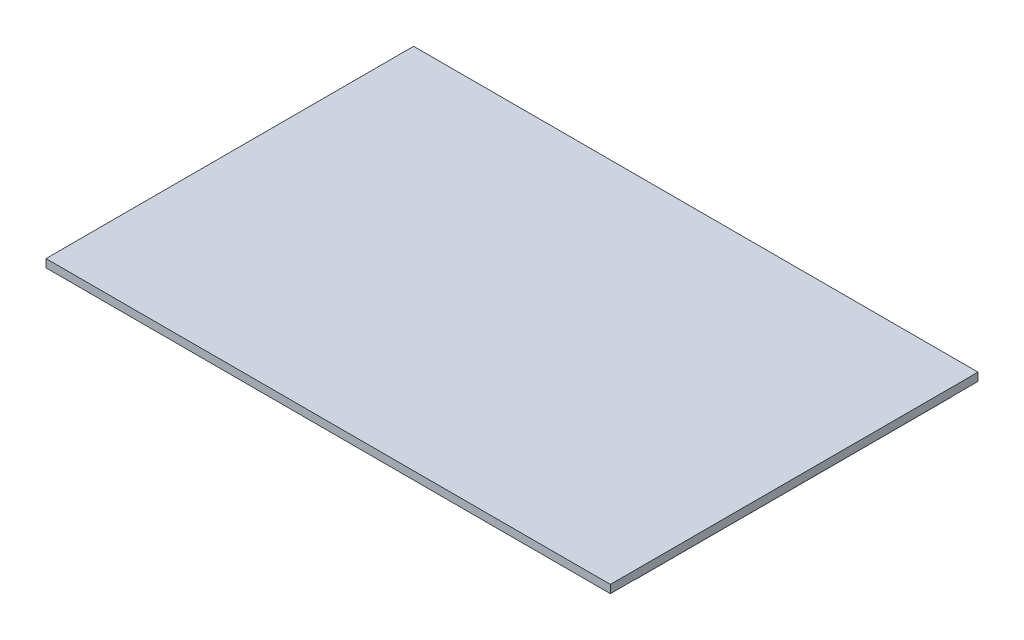
ISO-10303-21;
HEADER;
FILE_DESCRIPTION(('STEP AP214'),'2;1');
FILE_NAME('part.step','',(''),(''),'','','');
FILE_SCHEMA(('AUTOMOTIVE_DESIGN { 1 0 10303 214 1 1 1 1 }'));
ENDSEC;
DATA;
#1=APPLICATION_CONTEXT('core data for automotive mechanical design processes');
#2=APPLICATION_PROTOCOL_DEFINITION('international standard','automotive_design',2000,#1);
#3=PRODUCT_CONTEXT('',#1,'mechanical');
#4=PRODUCT('Part','Part','',(#3));
#5=PRODUCT_RELATED_PRODUCT_CATEGORY('part','',(#4));
#6=PRODUCT_DEFINITION_FORMATION('','',#4);
#7=PRODUCT_DEFINITION_CONTEXT('part definition',#1,'design');
#8=PRODUCT_DEFINITION('design','',#6,#7);
#9=PRODUCT_DEFINITION_SHAPE('','',#8);
#10=(LENGTH_UNIT() NAMED_UNIT(*) SI_UNIT(.MILLI.,.METRE.));
#11=(NAMED_UNIT(*) PLANE_ANGLE_UNIT() SI_UNIT($,.RADIAN.));
#12=(NAMED_UNIT(*) SI_UNIT($,.STERADIAN.) SOLID_ANGLE_UNIT());
#13=UNCERTAINTY_MEASURE_WITH_UNIT(LENGTH_MEASURE(1.E-05),#10,'distance_accuracy_value','');
#14=(GEOMETRIC_REPRESENTATION_CONTEXT(3) GLOBAL_UNCERTAINTY_ASSIGNED_CONTEXT((#13)) GLOBAL_UNIT_ASSIGNED_CONTEXT((#10,
#11,#12)) REPRESENTATION_CONTEXT('',''));
#15=CARTESIAN_POINT('',(0.,0.,0.));
#16=DIRECTION('',(0.,0.,1.));
#17=DIRECTION('',(1.,0.,0.));
#18=AXIS2_PLACEMENT_3D('',#15,#16,#17);
#19=CARTESIAN_POINT('',(0.,-0.0508,-5.08));
#20=DIRECTION('',(1.,0.,0.));
#21=DIRECTION('',(0.,0.,-1.));
#22=AXIS2_PLACEMENT_3D('',#19,#20,#21);
#23=PLANE('',#22);
#24=DIRECTION('',(0.,0.,-1.));
#25=VECTOR('',#24,1.);
#26=CARTESIAN_POINT('',(0.,0.,-5.08));
#27=LINE('',#26,#25);
#28=CARTESIAN_POINT('',(0.,0.,-5.08));
#29=VERTEX_POINT('',#28);
#30=CARTESIAN_POINT('',(0.,0.,-67.31));
#31=VERTEX_POINT('',#30);
#32=EDGE_CURVE('E106',#29,#31,#27,.T.);
#33=ORIENTED_EDGE('',*,*,#32,.T.);
#34=DIRECTION('',(0.,1.,0.));
#35=VECTOR('',#34,1.);
#36=CARTESIAN_POINT('',(0.,-0.0508,-67.31));
#37=LINE('',#36,#35);
#38=CARTESIAN_POINT('',(0.,-0.0508,-67.31));
#39=VERTEX_POINT('',#38);
#40=EDGE_CURVE('E12',#39,#31,#37,.T.);
#41=ORIENTED_EDGE('',*,*,#40,.F.);
#42=DIRECTION('',(0.,0.,-1.));
#43=VECTOR('',#42,1.);
#44=CARTESIAN_POINT('',(0.,-0.0508,-5.08));
#45=LINE('',#44,#43);
#46=CARTESIAN_POINT('',(0.,-0.0508,-5.08));
#47=VERTEX_POINT('',#46);
#48=EDGE_CURVE('E94',#47,#39,#45,.T.);
#49=ORIENTED_EDGE('',*,*,#48,.F.);
#50=DIRECTION('',(0.,1.,0.));
#51=VECTOR('',#50,1.);
#52=CARTESIAN_POINT('',(0.,-0.0508,-5.08));
#53=LINE('',#52,#51);
#54=EDGE_CURVE('E102',#47,#29,#53,.T.);
#55=ORIENTED_EDGE('',*,*,#54,.T.);
#56=EDGE_LOOP('',(#33,#41,#49,#55));
#57=FACE_BOUND('',#56,.T.);
#58=ADVANCED_FACE('F43',(#57),#23,.F.);
#59=CARTESIAN_POINT('',(0.,-0.0508,-67.31));
#60=DIRECTION('',(0.,0.,1.));
#61=DIRECTION('',(1.,0.,0.));
#62=AXIS2_PLACEMENT_3D('',#59,#60,#61);
#63=PLANE('',#62);
#64=DIRECTION('',(1.,0.,0.));
#65=VECTOR('',#64,1.);
#66=CARTESIAN_POINT('',(0.,0.,-67.31));
#67=LINE('',#66,#65);
#68=CARTESIAN_POINT('',(111.125,0.,-67.31));
#69=VERTEX_POINT('',#68);
#70=EDGE_CURVE('E98',#31,#69,#67,.T.);
#71=ORIENTED_EDGE('',*,*,#70,.T.);
#72=DIRECTION('',(0.,1.,0.));
#73=VECTOR('',#72,1.);
#74=CARTESIAN_POINT('',(111.125,-0.0508,-67.31));
#75=LINE('',#74,#73);
#76=CARTESIAN_POINT('',(111.125,-0.0508,-67.31));
#77=VERTEX_POINT('',#76);
#78=EDGE_CURVE('E51',#77,#69,#75,.T.);
#79=ORIENTED_EDGE('',*,*,#78,.F.);
#80=DIRECTION('',(1.,0.,0.));
#81=VECTOR('',#80,1.);
#82=CARTESIAN_POINT('',(0.,-0.0508,-67.31));
#83=LINE('',#82,#81);
#84=EDGE_CURVE('E89',#39,#77,#83,.T.);
#85=ORIENTED_EDGE('',*,*,#84,.F.);
#86=ORIENTED_EDGE('',*,*,#40,.T.);
#87=EDGE_LOOP('',(#71,#79,#85,#86));
#88=FACE_BOUND('',#87,.T.);
#89=ADVANCED_FACE('F97',(#88),#63,.F.);
#90=CARTESIAN_POINT('',(111.125,-0.0508,-5.08));
#91=DIRECTION('',(-1.,0.,0.));
#92=DIRECTION('',(0.,0.,1.));
#93=AXIS2_PLACEMENT_3D('',#90,#91,#92);
#94=PLANE('',#93);
#95=DIRECTION('',(0.,0.,1.));
#96=VECTOR('',#95,1.);
#97=CARTESIAN_POINT('',(111.125,0.,-5.08));
#98=LINE('',#97,#96);
#99=CARTESIAN_POINT('',(111.125,0.,-5.08));
#100=VERTEX_POINT('',#99);
#101=EDGE_CURVE('E76',#69,#100,#98,.T.);
#102=ORIENTED_EDGE('',*,*,#101,.T.);
#103=DIRECTION('',(0.,1.,0.));
#104=VECTOR('',#103,1.);
#105=CARTESIAN_POINT('',(111.125,-0.0508,-5.08));
#106=LINE('',#105,#104);
#107=CARTESIAN_POINT('',(111.125,-0.0508,-5.08));
#108=VERTEX_POINT('',#107);
#109=EDGE_CURVE('E99',#108,#100,#106,.T.);
#110=ORIENTED_EDGE('',*,*,#109,.F.);
#111=DIRECTION('',(0.,0.,1.));
#112=VECTOR('',#111,1.);
#113=CARTESIAN_POINT('',(111.125,-0.0508,-5.08));
#114=LINE('',#113,#112);
#115=EDGE_CURVE('E92',#77,#108,#114,.T.);
#116=ORIENTED_EDGE('',*,*,#115,.F.);
#117=ORIENTED_EDGE('',*,*,#78,.T.);
#118=EDGE_LOOP('',(#102,#110,#116,#117));
#119=FACE_BOUND('',#118,.T.);
#120=ADVANCED_FACE('F100',(#119),#94,.F.);
#121=CARTESIAN_POINT('',(0.,-0.0508,-5.08));
#122=DIRECTION('',(0.,0.,-1.));
#123=DIRECTION('',(-1.,0.,0.));
#124=AXIS2_PLACEMENT_3D('',#121,#122,#123);
#125=PLANE('',#124);
#126=DIRECTION('',(-1.,0.,0.));
#127=VECTOR('',#126,1.);
#128=CARTESIAN_POINT('',(0.,0.,-5.08));
#129=LINE('',#128,#127);
#130=EDGE_CURVE('E82',#100,#29,#129,.T.);
#131=ORIENTED_EDGE('',*,*,#130,.T.);
#132=ORIENTED_EDGE('',*,*,#54,.F.);
#133=DIRECTION('',(-1.,0.,0.));
#134=VECTOR('',#133,1.);
#135=CARTESIAN_POINT('',(0.,-0.0508,-5.08));
#136=LINE('',#135,#134);
#137=EDGE_CURVE('E59',#108,#47,#136,.T.);
#138=ORIENTED_EDGE('',*,*,#137,.F.);
#139=ORIENTED_EDGE('',*,*,#109,.T.);
#140=EDGE_LOOP('',(#131,#132,#138,#139));
#141=FACE_BOUND('',#140,.T.);
#142=ADVANCED_FACE('F113',(#141),#125,.F.);
#143=CARTESIAN_POINT('',(0.,-0.0508,0.));
#144=DIRECTION('',(0.,-1.,0.));
#145=DIRECTION('',(0.,0.,-1.));
#146=AXIS2_PLACEMENT_3D('',#143,#144,#145);
#147=PLANE('',#146);
#148=ORIENTED_EDGE('',*,*,#48,.T.);
#149=ORIENTED_EDGE('',*,*,#84,.T.);
#150=ORIENTED_EDGE('',*,*,#115,.T.);
#151=ORIENTED_EDGE('',*,*,#137,.T.);
#152=EDGE_LOOP('',(#148,#149,#150,#151));
#153=FACE_BOUND('',#152,.T.);
#154=ADVANCED_FACE('F90',(#153),#147,.T.);
#155=CARTESIAN_POINT('',(0.,0.,0.));
#156=DIRECTION('',(0.,-1.,0.));
#157=DIRECTION('',(0.,0.,-1.));
#158=AXIS2_PLACEMENT_3D('',#155,#156,#157);
#159=PLANE('',#158);
#160=ORIENTED_EDGE('',*,*,#32,.F.);
#161=ORIENTED_EDGE('',*,*,#130,.F.);
#162=ORIENTED_EDGE('',*,*,#101,.F.);
#163=ORIENTED_EDGE('',*,*,#70,.F.);
#164=EDGE_LOOP('',(#160,#161,#162,#163));
#165=FACE_BOUND('',#164,.T.);
#166=ADVANCED_FACE('F116',(#165),#159,.F.);
#167=CLOSED_SHELL('',(#58,#89,#120,#142,#154,#166));
#168=MANIFOLD_SOLID_BREP('B2',#167);
#169=CARTESIAN_POINT('',(0.,1.5875,0.));
#170=DIRECTION('',(1.,0.,0.));
#171=DIRECTION('',(0.,0.,-1.));
#172=AXIS2_PLACEMENT_3D('',#169,#170,#171);
#173=PLANE('',#172);
#174=DIRECTION('',(0.,0.,1.));
#175=VECTOR('',#174,1.);
#176=CARTESIAN_POINT('',(0.,0.,0.));
#177=LINE('',#176,#175);
#178=CARTESIAN_POINT('',(0.,0.,-72.39));
#179=VERTEX_POINT('',#178);
#180=CARTESIAN_POINT('',(0.,0.,0.));
#181=VERTEX_POINT('',#180);
#182=EDGE_CURVE('E229',#179,#181,#177,.T.);
#183=ORIENTED_EDGE('',*,*,#182,.T.);
#184=DIRECTION('',(0.,-1.,0.));
#185=VECTOR('',#184,1.);
#186=CARTESIAN_POINT('',(0.,1.5875,0.));
#187=LINE('',#186,#185);
#188=CARTESIAN_POINT('',(0.,1.5875,0.));
#189=VERTEX_POINT('',#188);
#190=EDGE_CURVE('E41',#189,#181,#187,.T.);
#191=ORIENTED_EDGE('',*,*,#190,.F.);
#192=DIRECTION('',(0.,0.,1.));
#193=VECTOR('',#192,1.);
#194=CARTESIAN_POINT('',(0.,1.5875,0.));
#195=LINE('',#194,#193);
#196=CARTESIAN_POINT('',(0.,1.5875,-72.39));
#197=VERTEX_POINT('',#196);
#198=EDGE_CURVE('E217',#197,#189,#195,.T.);
#199=ORIENTED_EDGE('',*,*,#198,.F.);
#200=DIRECTION('',(0.,-1.,0.));
#201=VECTOR('',#200,1.);
#202=CARTESIAN_POINT('',(0.,1.5875,-72.39));
#203=LINE('',#202,#201);
#204=EDGE_CURVE('E225',#197,#179,#203,.T.);
#205=ORIENTED_EDGE('',*,*,#204,.T.);
#206=EDGE_LOOP('',(#183,#191,#199,#205));
#207=FACE_BOUND('',#206,.T.);
#208=ADVANCED_FACE('F166',(#207),#173,.F.);
#209=CARTESIAN_POINT('',(0.,1.5875,0.));
#210=DIRECTION('',(0.,0.,-1.));
#211=DIRECTION('',(-1.,0.,0.));
#212=AXIS2_PLACEMENT_3D('',#209,#210,#211);
#213=PLANE('',#212);
#214=DIRECTION('',(1.,0.,0.));
#215=VECTOR('',#214,1.);
#216=CARTESIAN_POINT('',(0.,0.,0.));
#217=LINE('',#216,#215);
#218=CARTESIAN_POINT('',(111.125,0.,0.));
#219=VERTEX_POINT('',#218);
#220=EDGE_CURVE('E221',#181,#219,#217,.T.);
#221=ORIENTED_EDGE('',*,*,#220,.T.);
#222=DIRECTION('',(0.,-1.,0.));
#223=VECTOR('',#222,1.);
#224=CARTESIAN_POINT('',(111.125,1.5875,0.));
#225=LINE('',#224,#223);
#226=CARTESIAN_POINT('',(111.125,1.5875,0.));
#227=VERTEX_POINT('',#226);
#228=EDGE_CURVE('E174',#227,#219,#225,.T.);
#229=ORIENTED_EDGE('',*,*,#228,.F.);
#230=DIRECTION('',(1.,0.,0.));
#231=VECTOR('',#230,1.);
#232=CARTESIAN_POINT('',(0.,1.5875,0.));
#233=LINE('',#232,#231);
#234=EDGE_CURVE('E212',#189,#227,#233,.T.);
#235=ORIENTED_EDGE('',*,*,#234,.F.);
#236=ORIENTED_EDGE('',*,*,#190,.T.);
#237=EDGE_LOOP('',(#221,#229,#235,#236));
#238=FACE_BOUND('',#237,.T.);
#239=ADVANCED_FACE('F220',(#238),#213,.F.);
#240=CARTESIAN_POINT('',(111.125,1.5875,0.));
#241=DIRECTION('',(-1.,0.,0.));
#242=DIRECTION('',(0.,0.,1.));
#243=AXIS2_PLACEMENT_3D('',#240,#241,#242);
#244=PLANE('',#243);
#245=DIRECTION('',(0.,0.,-1.));
#246=VECTOR('',#245,1.);
#247=CARTESIAN_POINT('',(111.125,0.,0.));
#248=LINE('',#247,#246);
#249=CARTESIAN_POINT('',(111.125,0.,-72.39));
#250=VERTEX_POINT('',#249);
#251=EDGE_CURVE('E199',#219,#250,#248,.T.);
#252=ORIENTED_EDGE('',*,*,#251,.T.);
#253=DIRECTION('',(0.,-1.,0.));
#254=VECTOR('',#253,1.);
#255=CARTESIAN_POINT('',(111.125,1.5875,-72.39));
#256=LINE('',#255,#254);
#257=CARTESIAN_POINT('',(111.125,1.5875,-72.39));
#258=VERTEX_POINT('',#257);
#259=EDGE_CURVE('E222',#258,#250,#256,.T.);
#260=ORIENTED_EDGE('',*,*,#259,.F.);
#261=DIRECTION('',(0.,0.,-1.));
#262=VECTOR('',#261,1.);
#263=CARTESIAN_POINT('',(111.125,1.5875,0.));
#264=LINE('',#263,#262);
#265=EDGE_CURVE('E215',#227,#258,#264,.T.);
#266=ORIENTED_EDGE('',*,*,#265,.F.);
#267=ORIENTED_EDGE('',*,*,#228,.T.);
#268=EDGE_LOOP('',(#252,#260,#266,#267));
#269=FACE_BOUND('',#268,.T.);
#270=ADVANCED_FACE('F223',(#269),#244,.F.);
#271=CARTESIAN_POINT('',(0.,1.5875,-72.39));
#272=DIRECTION('',(0.,0.,1.));
#273=DIRECTION('',(1.,0.,0.));
#274=AXIS2_PLACEMENT_3D('',#271,#272,#273);
#275=PLANE('',#274);
#276=DIRECTION('',(-1.,0.,0.));
#277=VECTOR('',#276,1.);
#278=CARTESIAN_POINT('',(0.,0.,-72.39));
#279=LINE('',#278,#277);
#280=EDGE_CURVE('E205',#250,#179,#279,.T.);
#281=ORIENTED_EDGE('',*,*,#280,.T.);
#282=ORIENTED_EDGE('',*,*,#204,.F.);
#283=DIRECTION('',(-1.,0.,0.));
#284=VECTOR('',#283,1.);
#285=CARTESIAN_POINT('',(0.,1.5875,-72.39));
#286=LINE('',#285,#284);
#287=EDGE_CURVE('E182',#258,#197,#286,.T.);
#288=ORIENTED_EDGE('',*,*,#287,.F.);
#289=ORIENTED_EDGE('',*,*,#259,.T.);
#290=EDGE_LOOP('',(#281,#282,#288,#289));
#291=FACE_BOUND('',#290,.T.);
#292=ADVANCED_FACE('F236',(#291),#275,.F.);
#293=CARTESIAN_POINT('',(0.,1.5875,0.));
#294=DIRECTION('',(0.,-1.,0.));
#295=DIRECTION('',(0.,0.,-1.));
#296=AXIS2_PLACEMENT_3D('',#293,#294,#295);
#297=PLANE('',#296);
#298=ORIENTED_EDGE('',*,*,#198,.T.);
#299=ORIENTED_EDGE('',*,*,#234,.T.);
#300=ORIENTED_EDGE('',*,*,#265,.T.);
#301=ORIENTED_EDGE('',*,*,#287,.T.);
#302=EDGE_LOOP('',(#298,#299,#300,#301));
#303=FACE_BOUND('',#302,.T.);
#304=ADVANCED_FACE('F213',(#303),#297,.F.);
#305=CARTESIAN_POINT('',(0.,0.,0.));
#306=DIRECTION('',(0.,-1.,0.));
#307=DIRECTION('',(0.,0.,-1.));
#308=AXIS2_PLACEMENT_3D('',#305,#306,#307);
#309=PLANE('',#308);
#310=ORIENTED_EDGE('',*,*,#182,.F.);
#311=ORIENTED_EDGE('',*,*,#280,.F.);
#312=ORIENTED_EDGE('',*,*,#251,.F.);
#313=ORIENTED_EDGE('',*,*,#220,.F.);
#314=EDGE_LOOP('',(#310,#311,#312,#313));
#315=FACE_BOUND('',#314,.T.);
#316=ADVANCED_FACE('F239',(#315),#309,.T.);
#317=CLOSED_SHELL('',(#208,#239,#270,#292,#304,#316));
#318=MANIFOLD_SOLID_BREP('B6',#317);
#319=ADVANCED_BREP_SHAPE_REPRESENTATION('',(#18,#168,#318),#14);
#320=SHAPE_DEFINITION_REPRESENTATION(#9,#319);
ENDSEC;
END-ISO-10303-21;
